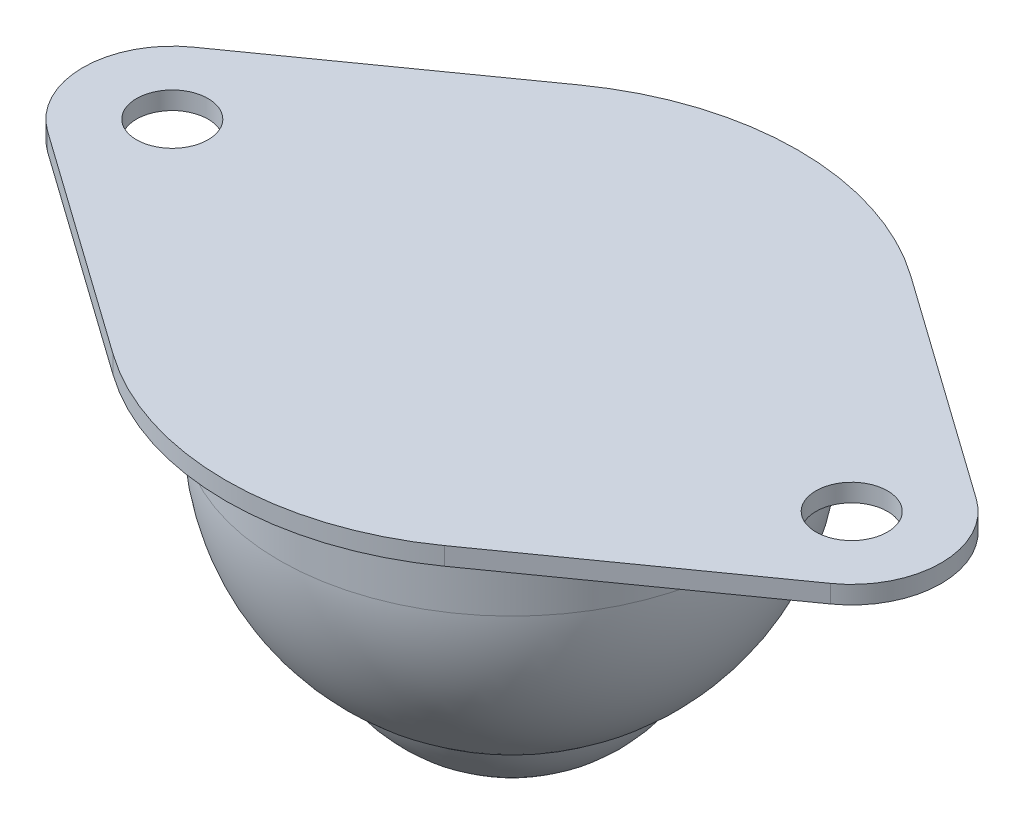
ISO-10303-21;
HEADER;
FILE_DESCRIPTION(('STEP AP214'),'2;1');
FILE_NAME('part.step','',(''),(''),'','','');
FILE_SCHEMA(('AUTOMOTIVE_DESIGN { 1 0 10303 214 1 1 1 1 }'));
ENDSEC;
DATA;
#1=APPLICATION_CONTEXT('core data for automotive mechanical design processes');
#2=APPLICATION_PROTOCOL_DEFINITION('international standard','automotive_design',2000,#1);
#3=PRODUCT_CONTEXT('',#1,'mechanical');
#4=PRODUCT('Part','Part','',(#3));
#5=PRODUCT_RELATED_PRODUCT_CATEGORY('part','',(#4));
#6=PRODUCT_DEFINITION_FORMATION('','',#4);
#7=PRODUCT_DEFINITION_CONTEXT('part definition',#1,'design');
#8=PRODUCT_DEFINITION('design','',#6,#7);
#9=PRODUCT_DEFINITION_SHAPE('','',#8);
#10=(LENGTH_UNIT() NAMED_UNIT(*) SI_UNIT(.MILLI.,.METRE.));
#11=(NAMED_UNIT(*) PLANE_ANGLE_UNIT() SI_UNIT($,.RADIAN.));
#12=(NAMED_UNIT(*) SI_UNIT($,.STERADIAN.) SOLID_ANGLE_UNIT());
#13=UNCERTAINTY_MEASURE_WITH_UNIT(LENGTH_MEASURE(1.E-05),#10,'distance_accuracy_value','');
#14=(GEOMETRIC_REPRESENTATION_CONTEXT(3) GLOBAL_UNCERTAINTY_ASSIGNED_CONTEXT((#13)) GLOBAL_UNIT_ASSIGNED_CONTEXT((#10,
#11,#12)) REPRESENTATION_CONTEXT('',''));
#15=CARTESIAN_POINT('',(0.,0.,0.));
#16=DIRECTION('',(0.,0.,1.));
#17=DIRECTION('',(1.,0.,0.));
#18=AXIS2_PLACEMENT_3D('',#15,#16,#17);
#19=CARTESIAN_POINT('',(0.,11.,0.));
#20=DIRECTION('',(0.,1.,0.));
#21=DIRECTION('',(0.,0.,1.));
#22=AXIS2_PLACEMENT_3D('',#19,#20,#21);
#23=CYLINDRICAL_SURFACE('',#22,13.);
#24=CARTESIAN_POINT('',(0.,11.,0.));
#25=DIRECTION('',(0.,1.,0.));
#26=DIRECTION('',(0.,0.,1.));
#27=AXIS2_PLACEMENT_3D('',#24,#25,#26);
#28=CIRCLE('',#27,13.);
#29=CARTESIAN_POINT('',(0.,11.,13.));
#30=VERTEX_POINT('',#29);
#31=EDGE_CURVE('E165',#30,#30,#28,.T.);
#32=ORIENTED_EDGE('',*,*,#31,.F.);
#33=EDGE_LOOP('',(#32));
#34=FACE_BOUND('',#33,.T.);
#35=CARTESIAN_POINT('',(0.,6.61838029079765,0.));
#36=DIRECTION('',(0.,1.,0.));
#37=DIRECTION('',(0.,0.,1.));
#38=AXIS2_PLACEMENT_3D('',#35,#36,#37);
#39=CIRCLE('',#38,13.);
#40=CARTESIAN_POINT('',(0.,6.61838029079765,13.));
#41=VERTEX_POINT('',#40);
#42=EDGE_CURVE('E168',#41,#41,#39,.T.);
#43=ORIENTED_EDGE('',*,*,#42,.T.);
#44=EDGE_LOOP('',(#43));
#45=FACE_BOUND('',#44,.T.);
#46=ADVANCED_FACE('F35',(#34,#45),#23,.T.);
#47=CARTESIAN_POINT('',(0.,6.61838029079765,0.));
#48=DIRECTION('',(0.,1.,0.));
#49=DIRECTION('',(1.,0.,0.));
#50=AXIS2_PLACEMENT_3D('',#47,#48,#49);
#51=SPHERICAL_SURFACE('',#50,13.);
#52=ORIENTED_EDGE('',*,*,#42,.F.);
#53=EDGE_LOOP('',(#52));
#54=FACE_BOUND('',#53,.T.);
#55=CARTESIAN_POINT('',(0.,-4.,0.));
#56=DIRECTION('',(0.,1.,0.));
#57=DIRECTION('',(0.,0.,1.));
#58=AXIS2_PLACEMENT_3D('',#55,#56,#57);
#59=CIRCLE('',#58,7.5);
#60=CARTESIAN_POINT('',(0.,-4.,7.5));
#61=VERTEX_POINT('',#60);
#62=EDGE_CURVE('E45',#61,#61,#59,.T.);
#63=ORIENTED_EDGE('',*,*,#62,.T.);
#64=EDGE_LOOP('',(#63));
#65=FACE_BOUND('',#64,.T.);
#66=ADVANCED_FACE('F179',(#54,#65),#51,.T.);
#67=CARTESIAN_POINT('',(0.,0.,0.));
#68=DIRECTION('',(0.,0.,-1.));
#69=DIRECTION('',(1.,0.,0.));
#70=AXIS2_PLACEMENT_3D('',#67,#68,#69);
#71=SPHERICAL_SURFACE('',#70,8.5);
#72=CARTESIAN_POINT('',(0.,0.,0.));
#73=DIRECTION('',(0.,1.,0.));
#74=DIRECTION('',(0.,0.,1.));
#75=AXIS2_PLACEMENT_3D('',#72,#73,#74);
#76=SPHERICAL_SURFACE('',#75,8.5);
#77=ORIENTED_EDGE('',*,*,#62,.F.);
#78=EDGE_LOOP('',(#77));
#79=FACE_BOUND('',#78,.T.);
#80=ADVANCED_FACE('F181',(#79),#76,.T.);
#81=CARTESIAN_POINT('',(-19.,11.,0.));
#82=DIRECTION('',(0.,1.,0.));
#83=DIRECTION('',(0.,0.,1.));
#84=AXIS2_PLACEMENT_3D('',#81,#82,#83);
#85=PLANE('',#84);
#86=CARTESIAN_POINT('',(19.,11.,0.));
#87=DIRECTION('',(0.,1.,0.));
#88=DIRECTION('',(0.,0.,-1.));
#89=AXIS2_PLACEMENT_3D('',#86,#87,#88);
#90=CIRCLE('',#89,2.);
#91=CARTESIAN_POINT('',(19.,11.,-2.00000000000001));
#92=VERTEX_POINT('',#91);
#93=EDGE_CURVE('E346',#92,#92,#90,.T.);
#94=ORIENTED_EDGE('',*,*,#93,.T.);
#95=EDGE_LOOP('',(#94));
#96=FACE_BOUND('',#95,.T.);
#97=CARTESIAN_POINT('',(-19.,11.,0.));
#98=DIRECTION('',(0.,1.,0.));
#99=DIRECTION('',(0.,0.,1.));
#100=AXIS2_PLACEMENT_3D('',#97,#98,#99);
#101=CIRCLE('',#100,5.);
#102=CARTESIAN_POINT('',(-21.8947368421053,11.,-4.07682457495517));
#103=VERTEX_POINT('',#102);
#104=CARTESIAN_POINT('',(-21.8947368421053,11.,4.07682457495518));
#105=VERTEX_POINT('',#104);
#106=EDGE_CURVE('E135',#103,#105,#101,.T.);
#107=ORIENTED_EDGE('',*,*,#106,.F.);
#108=DIRECTION('',(-0.815364914991035,0.,0.578947368421053));
#109=VECTOR('',#108,1.);
#110=CARTESIAN_POINT('',(-21.8947368421053,11.,-4.07682457495517));
#111=LINE('',#110,#109);
#112=CARTESIAN_POINT('',(-9.26315789473685,11.,-13.0458386398566));
#113=VERTEX_POINT('',#112);
#114=EDGE_CURVE('E88',#113,#103,#111,.T.);
#115=ORIENTED_EDGE('',*,*,#114,.F.);
#116=CARTESIAN_POINT('',(0.,11.,0.));
#117=DIRECTION('',(0.,1.,0.));
#118=DIRECTION('',(0.,0.,1.));
#119=AXIS2_PLACEMENT_3D('',#116,#117,#118);
#120=CIRCLE('',#119,16.);
#121=CARTESIAN_POINT('',(9.26315789473685,11.,-13.0458386398566));
#122=VERTEX_POINT('',#121);
#123=EDGE_CURVE('E82',#122,#113,#120,.T.);
#124=ORIENTED_EDGE('',*,*,#123,.F.);
#125=DIRECTION('',(-0.815364914991035,0.,-0.578947368421053));
#126=VECTOR('',#125,1.);
#127=CARTESIAN_POINT('',(21.8947368421053,11.,-4.07682457495518));
#128=LINE('',#127,#126);
#129=CARTESIAN_POINT('',(21.8947368421053,11.,-4.07682457495518));
#130=VERTEX_POINT('',#129);
#131=EDGE_CURVE('E125',#130,#122,#128,.T.);
#132=ORIENTED_EDGE('',*,*,#131,.F.);
#133=CARTESIAN_POINT('',(19.,11.,0.));
#134=DIRECTION('',(0.,1.,0.));
#135=DIRECTION('',(0.,0.,-1.));
#136=AXIS2_PLACEMENT_3D('',#133,#134,#135);
#137=CIRCLE('',#136,5.);
#138=CARTESIAN_POINT('',(21.8947368421053,11.,4.07682457495517));
#139=VERTEX_POINT('',#138);
#140=EDGE_CURVE('E145',#139,#130,#137,.T.);
#141=ORIENTED_EDGE('',*,*,#140,.F.);
#142=DIRECTION('',(0.815364914991035,0.,-0.578947368421053));
#143=VECTOR('',#142,1.);
#144=CARTESIAN_POINT('',(21.8947368421053,11.,4.07682457495517));
#145=LINE('',#144,#143);
#146=CARTESIAN_POINT('',(9.26315789473685,11.,13.0458386398566));
#147=VERTEX_POINT('',#146);
#148=EDGE_CURVE('E143',#147,#139,#145,.T.);
#149=ORIENTED_EDGE('',*,*,#148,.F.);
#150=CARTESIAN_POINT('',(0.,11.,0.));
#151=DIRECTION('',(0.,1.,0.));
#152=DIRECTION('',(0.,0.,1.));
#153=AXIS2_PLACEMENT_3D('',#150,#151,#152);
#154=CIRCLE('',#153,16.);
#155=CARTESIAN_POINT('',(-9.26315789473684,11.,13.0458386398566));
#156=VERTEX_POINT('',#155);
#157=EDGE_CURVE('E141',#156,#147,#154,.T.);
#158=ORIENTED_EDGE('',*,*,#157,.F.);
#159=DIRECTION('',(0.815364914991035,0.,0.578947368421053));
#160=VECTOR('',#159,1.);
#161=CARTESIAN_POINT('',(-21.8947368421053,11.,4.07682457495518));
#162=LINE('',#161,#160);
#163=EDGE_CURVE('E138',#105,#156,#162,.T.);
#164=ORIENTED_EDGE('',*,*,#163,.F.);
#165=EDGE_LOOP('',(#107,#115,#124,#132,#141,#149,#158,#164));
#166=FACE_BOUND('',#165,.T.);
#167=CARTESIAN_POINT('',(-19.,11.,0.));
#168=DIRECTION('',(0.,1.,0.));
#169=DIRECTION('',(0.,0.,1.));
#170=AXIS2_PLACEMENT_3D('',#167,#168,#169);
#171=CIRCLE('',#170,2.);
#172=CARTESIAN_POINT('',(-19.,11.,2.00000000000001));
#173=VERTEX_POINT('',#172);
#174=EDGE_CURVE('E348',#173,#173,#171,.T.);
#175=ORIENTED_EDGE('',*,*,#174,.T.);
#176=EDGE_LOOP('',(#175));
#177=FACE_BOUND('',#176,.T.);
#178=ORIENTED_EDGE('',*,*,#31,.T.);
#179=EDGE_LOOP('',(#178));
#180=FACE_BOUND('',#179,.T.);
#181=ADVANCED_FACE('F183',(#96,#166,#177,#180),#85,.F.);
#182=CARTESIAN_POINT('',(-19.,12.,0.));
#183=DIRECTION('',(0.,1.,0.));
#184=DIRECTION('',(0.,0.,1.));
#185=AXIS2_PLACEMENT_3D('',#182,#183,#184);
#186=PLANE('',#185);
#187=CARTESIAN_POINT('',(-19.,12.,0.));
#188=DIRECTION('',(0.,1.,0.));
#189=DIRECTION('',(0.,0.,1.));
#190=AXIS2_PLACEMENT_3D('',#187,#188,#189);
#191=CIRCLE('',#190,2.);
#192=CARTESIAN_POINT('',(-19.,12.,2.00000000000001));
#193=VERTEX_POINT('',#192);
#194=EDGE_CURVE('E139',#193,#193,#191,.T.);
#195=ORIENTED_EDGE('',*,*,#194,.F.);
#196=EDGE_LOOP('',(#195));
#197=FACE_BOUND('',#196,.T.);
#198=CARTESIAN_POINT('',(-19.,12.,0.));
#199=DIRECTION('',(0.,1.,0.));
#200=DIRECTION('',(0.,0.,1.));
#201=AXIS2_PLACEMENT_3D('',#198,#199,#200);
#202=CIRCLE('',#201,5.);
#203=CARTESIAN_POINT('',(-21.8947368421053,12.,-4.07682457495517));
#204=VERTEX_POINT('',#203);
#205=CARTESIAN_POINT('',(-21.8947368421053,12.,4.07682457495518));
#206=VERTEX_POINT('',#205);
#207=EDGE_CURVE('E150',#204,#206,#202,.T.);
#208=ORIENTED_EDGE('',*,*,#207,.T.);
#209=DIRECTION('',(0.815364914991035,0.,0.578947368421053));
#210=VECTOR('',#209,1.);
#211=CARTESIAN_POINT('',(-21.8947368421053,12.,4.07682457495518));
#212=LINE('',#211,#210);
#213=CARTESIAN_POINT('',(-9.26315789473684,12.,13.0458386398566));
#214=VERTEX_POINT('',#213);
#215=EDGE_CURVE('E97',#206,#214,#212,.T.);
#216=ORIENTED_EDGE('',*,*,#215,.T.);
#217=CARTESIAN_POINT('',(0.,12.,0.));
#218=DIRECTION('',(0.,1.,0.));
#219=DIRECTION('',(0.,0.,1.));
#220=AXIS2_PLACEMENT_3D('',#217,#218,#219);
#221=CIRCLE('',#220,16.);
#222=CARTESIAN_POINT('',(9.26315789473685,12.,13.0458386398566));
#223=VERTEX_POINT('',#222);
#224=EDGE_CURVE('E357',#214,#223,#221,.T.);
#225=ORIENTED_EDGE('',*,*,#224,.T.);
#226=DIRECTION('',(0.815364914991035,0.,-0.578947368421053));
#227=VECTOR('',#226,1.);
#228=CARTESIAN_POINT('',(21.8947368421053,12.,4.07682457495517));
#229=LINE('',#228,#227);
#230=CARTESIAN_POINT('',(21.8947368421053,12.,4.07682457495517));
#231=VERTEX_POINT('',#230);
#232=EDGE_CURVE('E359',#223,#231,#229,.T.);
#233=ORIENTED_EDGE('',*,*,#232,.T.);
#234=CARTESIAN_POINT('',(19.,12.,0.));
#235=DIRECTION('',(0.,1.,0.));
#236=DIRECTION('',(0.,0.,-1.));
#237=AXIS2_PLACEMENT_3D('',#234,#235,#236);
#238=CIRCLE('',#237,5.);
#239=CARTESIAN_POINT('',(21.8947368421053,12.,-4.07682457495518));
#240=VERTEX_POINT('',#239);
#241=EDGE_CURVE('E117',#231,#240,#238,.T.);
#242=ORIENTED_EDGE('',*,*,#241,.T.);
#243=DIRECTION('',(-0.815364914991035,0.,-0.578947368421053));
#244=VECTOR('',#243,1.);
#245=CARTESIAN_POINT('',(21.8947368421053,12.,-4.07682457495518));
#246=LINE('',#245,#244);
#247=CARTESIAN_POINT('',(9.26315789473685,12.,-13.0458386398566));
#248=VERTEX_POINT('',#247);
#249=EDGE_CURVE('E110',#240,#248,#246,.T.);
#250=ORIENTED_EDGE('',*,*,#249,.T.);
#251=CARTESIAN_POINT('',(0.,12.,0.));
#252=DIRECTION('',(0.,1.,0.));
#253=DIRECTION('',(0.,0.,1.));
#254=AXIS2_PLACEMENT_3D('',#251,#252,#253);
#255=CIRCLE('',#254,16.);
#256=CARTESIAN_POINT('',(-9.26315789473685,12.,-13.0458386398566));
#257=VERTEX_POINT('',#256);
#258=EDGE_CURVE('E115',#248,#257,#255,.T.);
#259=ORIENTED_EDGE('',*,*,#258,.T.);
#260=DIRECTION('',(-0.815364914991035,0.,0.578947368421053));
#261=VECTOR('',#260,1.);
#262=CARTESIAN_POINT('',(-21.8947368421053,12.,-4.07682457495517));
#263=LINE('',#262,#261);
#264=EDGE_CURVE('E53',#257,#204,#263,.T.);
#265=ORIENTED_EDGE('',*,*,#264,.T.);
#266=EDGE_LOOP('',(#208,#216,#225,#233,#242,#250,#259,#265));
#267=FACE_BOUND('',#266,.T.);
#268=CARTESIAN_POINT('',(19.,12.,0.));
#269=DIRECTION('',(0.,1.,0.));
#270=DIRECTION('',(0.,0.,-1.));
#271=AXIS2_PLACEMENT_3D('',#268,#269,#270);
#272=CIRCLE('',#271,2.);
#273=CARTESIAN_POINT('',(19.,12.,-2.00000000000001));
#274=VERTEX_POINT('',#273);
#275=EDGE_CURVE('E343',#274,#274,#272,.T.);
#276=ORIENTED_EDGE('',*,*,#275,.F.);
#277=EDGE_LOOP('',(#276));
#278=FACE_BOUND('',#277,.T.);
#279=ADVANCED_FACE('F112',(#197,#267,#278),#186,.T.);
#280=CARTESIAN_POINT('',(-19.,12.,0.));
#281=DIRECTION('',(0.,-1.,0.));
#282=DIRECTION('',(0.,0.,-1.));
#283=AXIS2_PLACEMENT_3D('',#280,#281,#282);
#284=CYLINDRICAL_SURFACE('',#283,5.);
#285=ORIENTED_EDGE('',*,*,#106,.T.);
#286=DIRECTION('',(0.,-1.,0.));
#287=VECTOR('',#286,1.);
#288=CARTESIAN_POINT('',(-21.8947368421053,12.,4.07682457495518));
#289=LINE('',#288,#287);
#290=EDGE_CURVE('E163',#206,#105,#289,.T.);
#291=ORIENTED_EDGE('',*,*,#290,.F.);
#292=ORIENTED_EDGE('',*,*,#207,.F.);
#293=DIRECTION('',(0.,-1.,0.));
#294=VECTOR('',#293,1.);
#295=CARTESIAN_POINT('',(-21.8947368421053,12.,-4.07682457495517));
#296=LINE('',#295,#294);
#297=EDGE_CURVE('E131',#204,#103,#296,.T.);
#298=ORIENTED_EDGE('',*,*,#297,.T.);
#299=EDGE_LOOP('',(#285,#291,#292,#298));
#300=FACE_BOUND('',#299,.T.);
#301=ADVANCED_FACE('F204',(#300),#284,.T.);
#302=CARTESIAN_POINT('',(-21.8947368421053,12.,4.07682457495518));
#303=DIRECTION('',(0.578947368421053,0.,-0.815364914991035));
#304=DIRECTION('',(-0.815364914991035,0.,-0.578947368421053));
#305=AXIS2_PLACEMENT_3D('',#302,#303,#304);
#306=PLANE('',#305);
#307=ORIENTED_EDGE('',*,*,#163,.T.);
#308=DIRECTION('',(0.,-1.,0.));
#309=VECTOR('',#308,1.);
#310=CARTESIAN_POINT('',(-9.26315789473684,12.,13.0458386398566));
#311=LINE('',#310,#309);
#312=EDGE_CURVE('E160',#214,#156,#311,.T.);
#313=ORIENTED_EDGE('',*,*,#312,.F.);
#314=ORIENTED_EDGE('',*,*,#215,.F.);
#315=ORIENTED_EDGE('',*,*,#290,.T.);
#316=EDGE_LOOP('',(#307,#313,#314,#315));
#317=FACE_BOUND('',#316,.T.);
#318=ADVANCED_FACE('F255',(#317),#306,.F.);
#319=CARTESIAN_POINT('',(0.,12.,0.));
#320=DIRECTION('',(0.,-1.,0.));
#321=DIRECTION('',(0.,0.,-1.));
#322=AXIS2_PLACEMENT_3D('',#319,#320,#321);
#323=CYLINDRICAL_SURFACE('',#322,16.);
#324=ORIENTED_EDGE('',*,*,#157,.T.);
#325=DIRECTION('',(0.,-1.,0.));
#326=VECTOR('',#325,1.);
#327=CARTESIAN_POINT('',(9.26315789473685,12.,13.0458386398566));
#328=LINE('',#327,#326);
#329=EDGE_CURVE('E157',#223,#147,#328,.T.);
#330=ORIENTED_EDGE('',*,*,#329,.F.);
#331=ORIENTED_EDGE('',*,*,#224,.F.);
#332=ORIENTED_EDGE('',*,*,#312,.T.);
#333=EDGE_LOOP('',(#324,#330,#331,#332));
#334=FACE_BOUND('',#333,.T.);
#335=ADVANCED_FACE('F264',(#334),#323,.T.);
#336=CARTESIAN_POINT('',(21.8947368421053,12.,4.07682457495517));
#337=DIRECTION('',(-0.578947368421053,0.,-0.815364914991035));
#338=DIRECTION('',(-0.815364914991035,0.,0.578947368421053));
#339=AXIS2_PLACEMENT_3D('',#336,#337,#338);
#340=PLANE('',#339);
#341=ORIENTED_EDGE('',*,*,#148,.T.);
#342=DIRECTION('',(0.,-1.,0.));
#343=VECTOR('',#342,1.);
#344=CARTESIAN_POINT('',(21.8947368421053,12.,4.07682457495517));
#345=LINE('',#344,#343);
#346=EDGE_CURVE('E154',#231,#139,#345,.T.);
#347=ORIENTED_EDGE('',*,*,#346,.F.);
#348=ORIENTED_EDGE('',*,*,#232,.F.);
#349=ORIENTED_EDGE('',*,*,#329,.T.);
#350=EDGE_LOOP('',(#341,#347,#348,#349));
#351=FACE_BOUND('',#350,.T.);
#352=ADVANCED_FACE('F272',(#351),#340,.F.);
#353=CARTESIAN_POINT('',(19.,12.,0.));
#354=DIRECTION('',(0.,-1.,0.));
#355=DIRECTION('',(0.,0.,-1.));
#356=AXIS2_PLACEMENT_3D('',#353,#354,#355);
#357=CYLINDRICAL_SURFACE('',#356,5.);
#358=ORIENTED_EDGE('',*,*,#140,.T.);
#359=DIRECTION('',(0.,-1.,0.));
#360=VECTOR('',#359,1.);
#361=CARTESIAN_POINT('',(21.8947368421053,12.,-4.07682457495518));
#362=LINE('',#361,#360);
#363=EDGE_CURVE('E126',#240,#130,#362,.T.);
#364=ORIENTED_EDGE('',*,*,#363,.F.);
#365=ORIENTED_EDGE('',*,*,#241,.F.);
#366=ORIENTED_EDGE('',*,*,#346,.T.);
#367=EDGE_LOOP('',(#358,#364,#365,#366));
#368=FACE_BOUND('',#367,.T.);
#369=ADVANCED_FACE('F282',(#368),#357,.T.);
#370=CARTESIAN_POINT('',(21.8947368421053,12.,-4.07682457495518));
#371=DIRECTION('',(-0.578947368421053,0.,0.815364914991035));
#372=DIRECTION('',(0.815364914991035,0.,0.578947368421053));
#373=AXIS2_PLACEMENT_3D('',#370,#371,#372);
#374=PLANE('',#373);
#375=ORIENTED_EDGE('',*,*,#131,.T.);
#376=DIRECTION('',(0.,-1.,0.));
#377=VECTOR('',#376,1.);
#378=CARTESIAN_POINT('',(9.26315789473685,12.,-13.0458386398566));
#379=LINE('',#378,#377);
#380=EDGE_CURVE('E122',#248,#122,#379,.T.);
#381=ORIENTED_EDGE('',*,*,#380,.F.);
#382=ORIENTED_EDGE('',*,*,#249,.F.);
#383=ORIENTED_EDGE('',*,*,#363,.T.);
#384=EDGE_LOOP('',(#375,#381,#382,#383));
#385=FACE_BOUND('',#384,.T.);
#386=ADVANCED_FACE('F123',(#385),#374,.F.);
#387=CARTESIAN_POINT('',(0.,12.,0.));
#388=DIRECTION('',(0.,-1.,0.));
#389=DIRECTION('',(0.,0.,-1.));
#390=AXIS2_PLACEMENT_3D('',#387,#388,#389);
#391=CYLINDRICAL_SURFACE('',#390,16.);
#392=ORIENTED_EDGE('',*,*,#123,.T.);
#393=DIRECTION('',(0.,-1.,0.));
#394=VECTOR('',#393,1.);
#395=CARTESIAN_POINT('',(-9.26315789473685,12.,-13.0458386398566));
#396=LINE('',#395,#394);
#397=EDGE_CURVE('E127',#257,#113,#396,.T.);
#398=ORIENTED_EDGE('',*,*,#397,.F.);
#399=ORIENTED_EDGE('',*,*,#258,.F.);
#400=ORIENTED_EDGE('',*,*,#380,.T.);
#401=EDGE_LOOP('',(#392,#398,#399,#400));
#402=FACE_BOUND('',#401,.T.);
#403=ADVANCED_FACE('F129',(#402),#391,.T.);
#404=CARTESIAN_POINT('',(-21.8947368421053,12.,-4.07682457495517));
#405=DIRECTION('',(0.578947368421053,0.,0.815364914991035));
#406=DIRECTION('',(0.815364914991035,0.,-0.578947368421053));
#407=AXIS2_PLACEMENT_3D('',#404,#405,#406);
#408=PLANE('',#407);
#409=ORIENTED_EDGE('',*,*,#114,.T.);
#410=ORIENTED_EDGE('',*,*,#297,.F.);
#411=ORIENTED_EDGE('',*,*,#264,.F.);
#412=ORIENTED_EDGE('',*,*,#397,.T.);
#413=EDGE_LOOP('',(#409,#410,#411,#412));
#414=FACE_BOUND('',#413,.T.);
#415=ADVANCED_FACE('F309',(#414),#408,.F.);
#416=CARTESIAN_POINT('',(-19.,12.,0.));
#417=DIRECTION('',(0.,-1.,0.));
#418=DIRECTION('',(0.,0.,-1.));
#419=AXIS2_PLACEMENT_3D('',#416,#417,#418);
#420=CYLINDRICAL_SURFACE('',#419,2.);
#421=ORIENTED_EDGE('',*,*,#194,.T.);
#422=EDGE_LOOP('',(#421));
#423=FACE_BOUND('',#422,.T.);
#424=ORIENTED_EDGE('',*,*,#174,.F.);
#425=EDGE_LOOP('',(#424));
#426=FACE_BOUND('',#425,.T.);
#427=ADVANCED_FACE('F318',(#423,#426),#420,.F.);
#428=CARTESIAN_POINT('',(19.,12.,0.));
#429=DIRECTION('',(0.,-1.,0.));
#430=DIRECTION('',(0.,0.,-1.));
#431=AXIS2_PLACEMENT_3D('',#428,#429,#430);
#432=CYLINDRICAL_SURFACE('',#431,2.);
#433=ORIENTED_EDGE('',*,*,#275,.T.);
#434=EDGE_LOOP('',(#433));
#435=FACE_BOUND('',#434,.T.);
#436=ORIENTED_EDGE('',*,*,#93,.F.);
#437=EDGE_LOOP('',(#436));
#438=FACE_BOUND('',#437,.T.);
#439=ADVANCED_FACE('F327',(#435,#438),#432,.F.);
#440=CLOSED_SHELL('',(#46,#66,#80,#181,#279,#301,#318,#335,#352,#369,#386,#403,#415,#427,#439));
#441=CARTESIAN_POINT('',(0.,0.,0.));
#442=DIRECTION('',(0.,1.,0.));
#443=DIRECTION('',(0.,0.,1.));
#444=AXIS2_PLACEMENT_3D('',#441,#442,#443);
#445=SPHERICAL_SURFACE('',#444,8.5);
#446=CARTESIAN_POINT('',(0.,-2.11132037586593,0.));
#447=DIRECTION('',(0.,1.,0.));
#448=DIRECTION('',(0.,0.,1.));
#449=AXIS2_PLACEMENT_3D('',#446,#447,#448);
#450=CIRCLE('',#449,8.23360955295145);
#451=CARTESIAN_POINT('',(0.,-2.11132037586593,8.23360955295145));
#452=VERTEX_POINT('',#451);
#453=EDGE_CURVE('E11',#452,#452,#450,.F.);
#454=ORIENTED_EDGE('',*,*,#453,.F.);
#455=EDGE_LOOP('',(#454));
#456=FACE_BOUND('',#455,.T.);
#457=ADVANCED_FACE('F37',(#456),#445,.T.);
#458=CARTESIAN_POINT('',(0.,10.,0.));
#459=DIRECTION('',(0.,1.,0.));
#460=DIRECTION('',(0.,0.,1.));
#461=AXIS2_PLACEMENT_3D('',#458,#459,#460);
#462=PLANE('',#461);
#463=CARTESIAN_POINT('',(0.,10.,0.));
#464=DIRECTION('',(0.,1.,0.));
#465=DIRECTION('',(0.,0.,1.));
#466=AXIS2_PLACEMENT_3D('',#463,#464,#465);
#467=CIRCLE('',#466,12.);
#468=CARTESIAN_POINT('',(0.,10.,12.));
#469=VERTEX_POINT('',#468);
#470=EDGE_CURVE('E174',#469,#469,#467,.T.);
#471=ORIENTED_EDGE('',*,*,#470,.F.);
#472=EDGE_LOOP('',(#471));
#473=FACE_BOUND('',#472,.T.);
#474=ADVANCED_FACE('F193',(#473),#462,.F.);
#475=CARTESIAN_POINT('',(0.,11.,0.));
#476=DIRECTION('',(0.,1.,0.));
#477=DIRECTION('',(0.,0.,1.));
#478=AXIS2_PLACEMENT_3D('',#475,#476,#477);
#479=CYLINDRICAL_SURFACE('',#478,12.);
#480=CARTESIAN_POINT('',(0.,6.61838029079765,0.));
#481=DIRECTION('',(0.,1.,0.));
#482=DIRECTION('',(0.,0.,1.));
#483=AXIS2_PLACEMENT_3D('',#480,#481,#482);
#484=CIRCLE('',#483,12.);
#485=CARTESIAN_POINT('',(0.,6.61838029079765,12.));
#486=VERTEX_POINT('',#485);
#487=EDGE_CURVE('E171',#486,#486,#484,.T.);
#488=ORIENTED_EDGE('',*,*,#487,.F.);
#489=EDGE_LOOP('',(#488));
#490=FACE_BOUND('',#489,.T.);
#491=ORIENTED_EDGE('',*,*,#470,.T.);
#492=EDGE_LOOP('',(#491));
#493=FACE_BOUND('',#492,.T.);
#494=ADVANCED_FACE('F210',(#490,#493),#479,.F.);
#495=CARTESIAN_POINT('',(0.,6.61838029079765,0.));
#496=DIRECTION('',(0.,1.,0.));
#497=DIRECTION('',(1.,0.,0.));
#498=AXIS2_PLACEMENT_3D('',#495,#496,#497);
#499=SPHERICAL_SURFACE('',#498,12.);
#500=ORIENTED_EDGE('',*,*,#453,.T.);
#501=EDGE_LOOP('',(#500));
#502=FACE_BOUND('',#501,.T.);
#503=ORIENTED_EDGE('',*,*,#487,.T.);
#504=EDGE_LOOP('',(#503));
#505=FACE_BOUND('',#504,.T.);
#506=ADVANCED_FACE('F207',(#502,#505),#499,.F.);
#507=CLOSED_SHELL('',(#457,#474,#494,#506));
#508=ORIENTED_CLOSED_SHELL('',*,#507,.T.);
#509=BREP_WITH_VOIDS('B2',#440,(#508));
#510=ADVANCED_BREP_SHAPE_REPRESENTATION('',(#18,#509),#14);
#511=SHAPE_DEFINITION_REPRESENTATION(#9,#510);
ENDSEC;
END-ISO-10303-21;
